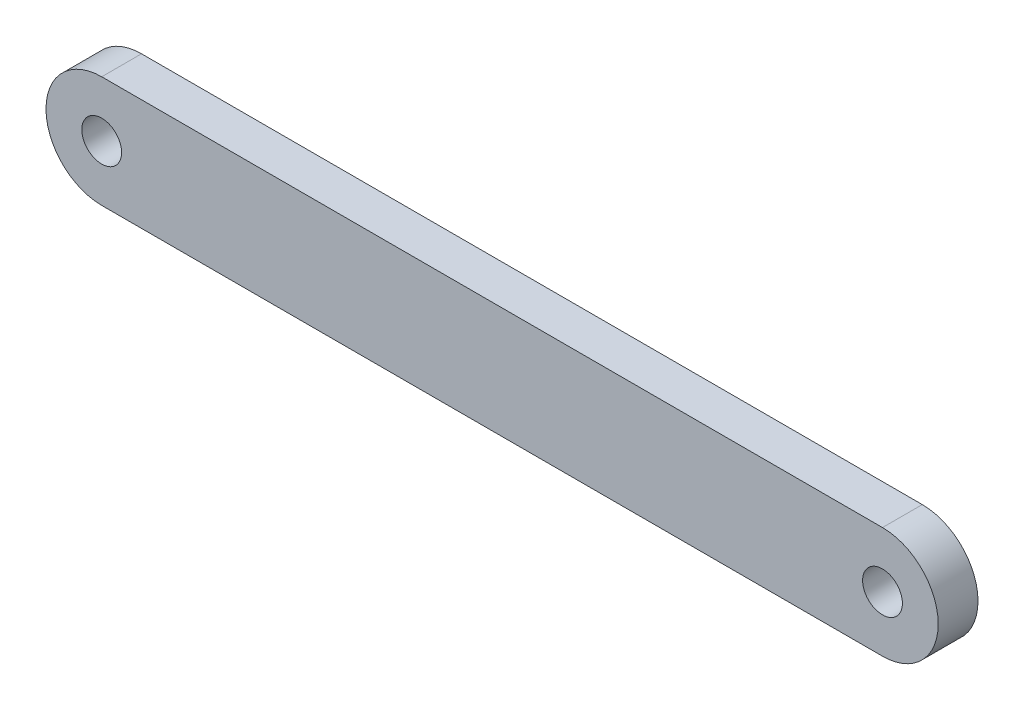
ISO-10303-21;
HEADER;
FILE_DESCRIPTION(('STEP AP214'),'2;1');
FILE_NAME('part.step','',(''),(''),'','','');
FILE_SCHEMA(('AUTOMOTIVE_DESIGN { 1 0 10303 214 1 1 1 1 }'));
ENDSEC;
DATA;
#1=APPLICATION_CONTEXT('core data for automotive mechanical design processes');
#2=APPLICATION_PROTOCOL_DEFINITION('international standard','automotive_design',2000,#1);
#3=PRODUCT_CONTEXT('',#1,'mechanical');
#4=PRODUCT('Part','Part','',(#3));
#5=PRODUCT_RELATED_PRODUCT_CATEGORY('part','',(#4));
#6=PRODUCT_DEFINITION_FORMATION('','',#4);
#7=PRODUCT_DEFINITION_CONTEXT('part definition',#1,'design');
#8=PRODUCT_DEFINITION('design','',#6,#7);
#9=PRODUCT_DEFINITION_SHAPE('','',#8);
#10=(LENGTH_UNIT() NAMED_UNIT(*) SI_UNIT(.MILLI.,.METRE.));
#11=(NAMED_UNIT(*) PLANE_ANGLE_UNIT() SI_UNIT($,.RADIAN.));
#12=(NAMED_UNIT(*) SI_UNIT($,.STERADIAN.) SOLID_ANGLE_UNIT());
#13=UNCERTAINTY_MEASURE_WITH_UNIT(LENGTH_MEASURE(1.E-05),#10,'distance_accuracy_value','');
#14=(GEOMETRIC_REPRESENTATION_CONTEXT(3) GLOBAL_UNCERTAINTY_ASSIGNED_CONTEXT((#13)) GLOBAL_UNIT_ASSIGNED_CONTEXT((#10,
#11,#12)) REPRESENTATION_CONTEXT('',''));
#15=CARTESIAN_POINT('',(0.,0.,0.));
#16=DIRECTION('',(0.,0.,1.));
#17=DIRECTION('',(1.,0.,0.));
#18=AXIS2_PLACEMENT_3D('',#15,#16,#17);
#19=CARTESIAN_POINT('',(61.3887983315269,0.0828935564845812,6.35));
#20=DIRECTION('',(0.,0.,-1.));
#21=DIRECTION('',(-1.,0.,0.));
#22=AXIS2_PLACEMENT_3D('',#19,#20,#21);
#23=PLANE('',#22);
#24=CARTESIAN_POINT('',(61.3887983315269,0.0828935564845812,6.35));
#25=DIRECTION('',(0.,0.,1.));
#26=DIRECTION('',(-1.,0.,0.));
#27=AXIS2_PLACEMENT_3D('',#24,#25,#26);
#28=CIRCLE('',#27,8.89);
#29=CARTESIAN_POINT('',(61.3887983315269,-8.80710644351542,6.35));
#30=VERTEX_POINT('',#29);
#31=CARTESIAN_POINT('',(61.3887983315269,8.97289355648458,6.35));
#32=VERTEX_POINT('',#31);
#33=EDGE_CURVE('E93',#30,#32,#28,.T.);
#34=ORIENTED_EDGE('',*,*,#33,.T.);
#35=DIRECTION('',(-1.,0.,0.));
#36=VECTOR('',#35,1.);
#37=CARTESIAN_POINT('',(-63.1952016684731,8.97289355648458,6.35));
#38=LINE('',#37,#36);
#39=CARTESIAN_POINT('',(-63.1952016684731,8.97289355648458,6.35));
#40=VERTEX_POINT('',#39);
#41=EDGE_CURVE('E88',#32,#40,#38,.T.);
#42=ORIENTED_EDGE('',*,*,#41,.T.);
#43=CARTESIAN_POINT('',(-63.1952016684731,0.0828935564845812,6.35));
#44=DIRECTION('',(0.,0.,1.));
#45=DIRECTION('',(1.,0.,0.));
#46=AXIS2_PLACEMENT_3D('',#43,#44,#45);
#47=CIRCLE('',#46,8.89);
#48=CARTESIAN_POINT('',(-63.1952016684731,-8.80710644351542,6.35));
#49=VERTEX_POINT('',#48);
#50=EDGE_CURVE('E90',#40,#49,#47,.T.);
#51=ORIENTED_EDGE('',*,*,#50,.T.);
#52=DIRECTION('',(1.,0.,0.));
#53=VECTOR('',#52,1.);
#54=CARTESIAN_POINT('',(-63.1952016684731,-8.80710644351542,6.35));
#55=LINE('',#54,#53);
#56=EDGE_CURVE('E57',#49,#30,#55,.T.);
#57=ORIENTED_EDGE('',*,*,#56,.T.);
#58=EDGE_LOOP('',(#34,#42,#51,#57));
#59=FACE_BOUND('',#58,.T.);
#60=CARTESIAN_POINT('',(-63.1952016684731,0.0828935564845812,6.35));
#61=DIRECTION('',(0.,0.,1.));
#62=DIRECTION('',(1.,0.,0.));
#63=AXIS2_PLACEMENT_3D('',#60,#61,#62);
#64=CIRCLE('',#63,3.175);
#65=CARTESIAN_POINT('',(-60.0202016684731,0.0828935564845812,6.35));
#66=VERTEX_POINT('',#65);
#67=EDGE_CURVE('E106',#66,#66,#64,.T.);
#68=ORIENTED_EDGE('',*,*,#67,.F.);
#69=EDGE_LOOP('',(#68));
#70=FACE_BOUND('',#69,.T.);
#71=CARTESIAN_POINT('',(61.3887983315269,0.0828935564845812,6.35));
#72=DIRECTION('',(0.,0.,1.));
#73=DIRECTION('',(1.,0.,0.));
#74=AXIS2_PLACEMENT_3D('',#71,#72,#73);
#75=CIRCLE('',#74,3.17499999999997);
#76=CARTESIAN_POINT('',(64.5637983315269,0.0828935564845812,6.35));
#77=VERTEX_POINT('',#76);
#78=EDGE_CURVE('E122',#77,#77,#75,.T.);
#79=ORIENTED_EDGE('',*,*,#78,.F.);
#80=EDGE_LOOP('',(#79));
#81=FACE_BOUND('',#80,.T.);
#82=ADVANCED_FACE('F39',(#59,#70,#81),#23,.F.);
#83=CARTESIAN_POINT('',(61.3887983315269,0.0828935564845812,0.));
#84=DIRECTION('',(0.,0.,-1.));
#85=DIRECTION('',(-1.,0.,0.));
#86=AXIS2_PLACEMENT_3D('',#83,#84,#85);
#87=PLANE('',#86);
#88=CARTESIAN_POINT('',(-63.1952016684731,0.0828935564845812,0.));
#89=DIRECTION('',(0.,0.,1.));
#90=DIRECTION('',(1.,0.,0.));
#91=AXIS2_PLACEMENT_3D('',#88,#89,#90);
#92=CIRCLE('',#91,3.175);
#93=CARTESIAN_POINT('',(-60.0202016684731,0.0828935564845812,0.));
#94=VERTEX_POINT('',#93);
#95=EDGE_CURVE('E117',#94,#94,#92,.T.);
#96=ORIENTED_EDGE('',*,*,#95,.T.);
#97=EDGE_LOOP('',(#96));
#98=FACE_BOUND('',#97,.T.);
#99=CARTESIAN_POINT('',(61.3887983315269,0.0828935564845812,0.));
#100=DIRECTION('',(0.,0.,1.));
#101=DIRECTION('',(-1.,0.,0.));
#102=AXIS2_PLACEMENT_3D('',#99,#100,#101);
#103=CIRCLE('',#102,8.89);
#104=CARTESIAN_POINT('',(61.3887983315269,-8.80710644351542,0.));
#105=VERTEX_POINT('',#104);
#106=CARTESIAN_POINT('',(61.3887983315269,8.97289355648458,0.));
#107=VERTEX_POINT('',#106);
#108=EDGE_CURVE('E103',#105,#107,#103,.T.);
#109=ORIENTED_EDGE('',*,*,#108,.F.);
#110=DIRECTION('',(1.,0.,0.));
#111=VECTOR('',#110,1.);
#112=CARTESIAN_POINT('',(-63.1952016684731,-8.80710644351542,0.));
#113=LINE('',#112,#111);
#114=CARTESIAN_POINT('',(-63.1952016684731,-8.80710644351542,0.));
#115=VERTEX_POINT('',#114);
#116=EDGE_CURVE('E78',#115,#105,#113,.T.);
#117=ORIENTED_EDGE('',*,*,#116,.F.);
#118=CARTESIAN_POINT('',(-63.1952016684731,0.0828935564845812,0.));
#119=DIRECTION('',(0.,0.,1.));
#120=DIRECTION('',(1.,0.,0.));
#121=AXIS2_PLACEMENT_3D('',#118,#119,#120);
#122=CIRCLE('',#121,8.89);
#123=CARTESIAN_POINT('',(-63.1952016684731,8.97289355648458,0.));
#124=VERTEX_POINT('',#123);
#125=EDGE_CURVE('E71',#124,#115,#122,.T.);
#126=ORIENTED_EDGE('',*,*,#125,.F.);
#127=DIRECTION('',(-1.,0.,0.));
#128=VECTOR('',#127,1.);
#129=CARTESIAN_POINT('',(-63.1952016684731,8.97289355648458,0.));
#130=LINE('',#129,#128);
#131=EDGE_CURVE('E92',#107,#124,#130,.T.);
#132=ORIENTED_EDGE('',*,*,#131,.F.);
#133=EDGE_LOOP('',(#109,#117,#126,#132));
#134=FACE_BOUND('',#133,.T.);
#135=CARTESIAN_POINT('',(61.3887983315269,0.0828935564845812,0.));
#136=DIRECTION('',(0.,0.,1.));
#137=DIRECTION('',(1.,0.,0.));
#138=AXIS2_PLACEMENT_3D('',#135,#136,#137);
#139=CIRCLE('',#138,3.17499999999997);
#140=CARTESIAN_POINT('',(64.5637983315269,0.0828935564845812,0.));
#141=VERTEX_POINT('',#140);
#142=EDGE_CURVE('E121',#141,#141,#139,.T.);
#143=ORIENTED_EDGE('',*,*,#142,.T.);
#144=EDGE_LOOP('',(#143));
#145=FACE_BOUND('',#144,.T.);
#146=ADVANCED_FACE('F111',(#98,#134,#145),#87,.T.);
#147=CARTESIAN_POINT('',(61.3887983315269,0.0828935564845812,6.35));
#148=DIRECTION('',(0.,0.,-1.));
#149=DIRECTION('',(-1.,0.,0.));
#150=AXIS2_PLACEMENT_3D('',#147,#148,#149);
#151=CYLINDRICAL_SURFACE('',#150,8.89);
#152=ORIENTED_EDGE('',*,*,#108,.T.);
#153=DIRECTION('',(0.,0.,-1.));
#154=VECTOR('',#153,1.);
#155=CARTESIAN_POINT('',(61.3887983315269,8.97289355648458,6.35));
#156=LINE('',#155,#154);
#157=EDGE_CURVE('E11',#32,#107,#156,.T.);
#158=ORIENTED_EDGE('',*,*,#157,.F.);
#159=ORIENTED_EDGE('',*,*,#33,.F.);
#160=DIRECTION('',(0.,0.,-1.));
#161=VECTOR('',#160,1.);
#162=CARTESIAN_POINT('',(61.3887983315269,-8.80710644351542,6.35));
#163=LINE('',#162,#161);
#164=EDGE_CURVE('E97',#30,#105,#163,.T.);
#165=ORIENTED_EDGE('',*,*,#164,.T.);
#166=EDGE_LOOP('',(#152,#158,#159,#165));
#167=FACE_BOUND('',#166,.T.);
#168=ADVANCED_FACE('F41',(#167),#151,.T.);
#169=CARTESIAN_POINT('',(-63.1952016684731,8.97289355648458,6.35));
#170=DIRECTION('',(0.,-1.,0.));
#171=DIRECTION('',(0.,0.,-1.));
#172=AXIS2_PLACEMENT_3D('',#169,#170,#171);
#173=PLANE('',#172);
#174=ORIENTED_EDGE('',*,*,#131,.T.);
#175=DIRECTION('',(0.,0.,-1.));
#176=VECTOR('',#175,1.);
#177=CARTESIAN_POINT('',(-63.1952016684731,8.97289355648458,6.35));
#178=LINE('',#177,#176);
#179=EDGE_CURVE('E48',#40,#124,#178,.T.);
#180=ORIENTED_EDGE('',*,*,#179,.F.);
#181=ORIENTED_EDGE('',*,*,#41,.F.);
#182=ORIENTED_EDGE('',*,*,#157,.T.);
#183=EDGE_LOOP('',(#174,#180,#181,#182));
#184=FACE_BOUND('',#183,.T.);
#185=ADVANCED_FACE('F94',(#184),#173,.F.);
#186=CARTESIAN_POINT('',(-63.1952016684731,0.0828935564845812,6.35));
#187=DIRECTION('',(0.,0.,-1.));
#188=DIRECTION('',(-1.,0.,0.));
#189=AXIS2_PLACEMENT_3D('',#186,#187,#188);
#190=CYLINDRICAL_SURFACE('',#189,8.89);
#191=ORIENTED_EDGE('',*,*,#125,.T.);
#192=DIRECTION('',(0.,0.,-1.));
#193=VECTOR('',#192,1.);
#194=CARTESIAN_POINT('',(-63.1952016684731,-8.80710644351542,6.35));
#195=LINE('',#194,#193);
#196=EDGE_CURVE('E96',#49,#115,#195,.T.);
#197=ORIENTED_EDGE('',*,*,#196,.F.);
#198=ORIENTED_EDGE('',*,*,#50,.F.);
#199=ORIENTED_EDGE('',*,*,#179,.T.);
#200=EDGE_LOOP('',(#191,#197,#198,#199));
#201=FACE_BOUND('',#200,.T.);
#202=ADVANCED_FACE('F100',(#201),#190,.T.);
#203=CARTESIAN_POINT('',(-63.1952016684731,-8.80710644351542,6.35));
#204=DIRECTION('',(0.,1.,0.));
#205=DIRECTION('',(0.,0.,1.));
#206=AXIS2_PLACEMENT_3D('',#203,#204,#205);
#207=PLANE('',#206);
#208=ORIENTED_EDGE('',*,*,#116,.T.);
#209=ORIENTED_EDGE('',*,*,#164,.F.);
#210=ORIENTED_EDGE('',*,*,#56,.F.);
#211=ORIENTED_EDGE('',*,*,#196,.T.);
#212=EDGE_LOOP('',(#208,#209,#210,#211));
#213=FACE_BOUND('',#212,.T.);
#214=ADVANCED_FACE('F112',(#213),#207,.F.);
#215=CARTESIAN_POINT('',(-63.1952016684731,0.0828935564845812,6.35));
#216=DIRECTION('',(0.,0.,-1.));
#217=DIRECTION('',(-1.,0.,0.));
#218=AXIS2_PLACEMENT_3D('',#215,#216,#217);
#219=CYLINDRICAL_SURFACE('',#218,3.175);
#220=ORIENTED_EDGE('',*,*,#67,.T.);
#221=EDGE_LOOP('',(#220));
#222=FACE_BOUND('',#221,.T.);
#223=ORIENTED_EDGE('',*,*,#95,.F.);
#224=EDGE_LOOP('',(#223));
#225=FACE_BOUND('',#224,.T.);
#226=ADVANCED_FACE('F143',(#222,#225),#219,.F.);
#227=CARTESIAN_POINT('',(61.3887983315269,0.0828935564845812,6.35));
#228=DIRECTION('',(0.,0.,-1.));
#229=DIRECTION('',(-1.,0.,0.));
#230=AXIS2_PLACEMENT_3D('',#227,#228,#229);
#231=CYLINDRICAL_SURFACE('',#230,3.17499999999997);
#232=ORIENTED_EDGE('',*,*,#78,.T.);
#233=EDGE_LOOP('',(#232));
#234=FACE_BOUND('',#233,.T.);
#235=ORIENTED_EDGE('',*,*,#142,.F.);
#236=EDGE_LOOP('',(#235));
#237=FACE_BOUND('',#236,.T.);
#238=ADVANCED_FACE('F128',(#234,#237),#231,.F.);
#239=CLOSED_SHELL('',(#82,#146,#168,#185,#202,#214,#226,#238));
#240=MANIFOLD_SOLID_BREP('B2',#239);
#241=ADVANCED_BREP_SHAPE_REPRESENTATION('',(#18,#240),#14);
#242=SHAPE_DEFINITION_REPRESENTATION(#9,#241);
ENDSEC;
END-ISO-10303-21;
